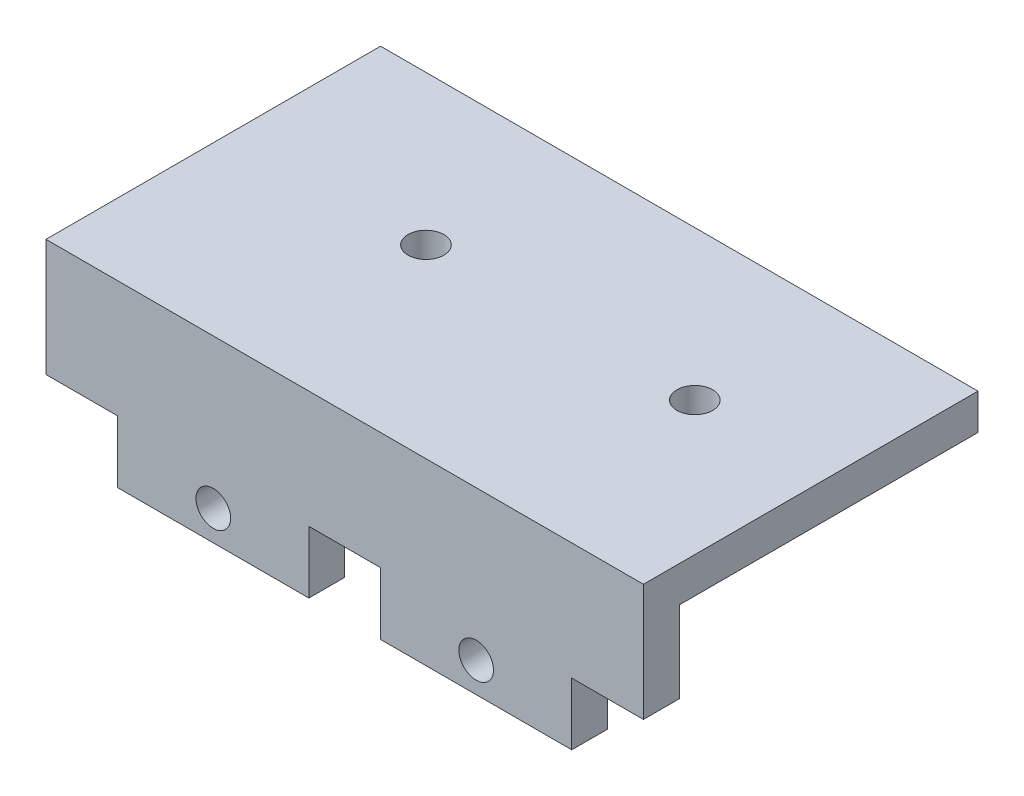
ISO-10303-21;
HEADER;
FILE_DESCRIPTION(('STEP AP214'),'2;1');
FILE_NAME('part.step','',(''),(''),'','','');
FILE_SCHEMA(('AUTOMOTIVE_DESIGN { 1 0 10303 214 1 1 1 1 }'));
ENDSEC;
DATA;
#1=APPLICATION_CONTEXT('core data for automotive mechanical design processes');
#2=APPLICATION_PROTOCOL_DEFINITION('international standard','automotive_design',2000,#1);
#3=PRODUCT_CONTEXT('',#1,'mechanical');
#4=PRODUCT('Part','Part','',(#3));
#5=PRODUCT_RELATED_PRODUCT_CATEGORY('part','',(#4));
#6=PRODUCT_DEFINITION_FORMATION('','',#4);
#7=PRODUCT_DEFINITION_CONTEXT('part definition',#1,'design');
#8=PRODUCT_DEFINITION('design','',#6,#7);
#9=PRODUCT_DEFINITION_SHAPE('','',#8);
#10=(LENGTH_UNIT() NAMED_UNIT(*) SI_UNIT(.MILLI.,.METRE.));
#11=(NAMED_UNIT(*) PLANE_ANGLE_UNIT() SI_UNIT($,.RADIAN.));
#12=(NAMED_UNIT(*) SI_UNIT($,.STERADIAN.) SOLID_ANGLE_UNIT());
#13=UNCERTAINTY_MEASURE_WITH_UNIT(LENGTH_MEASURE(1.E-05),#10,'distance_accuracy_value','');
#14=(GEOMETRIC_REPRESENTATION_CONTEXT(3) GLOBAL_UNCERTAINTY_ASSIGNED_CONTEXT((#13)) GLOBAL_UNIT_ASSIGNED_CONTEXT((#10,
#11,#12)) REPRESENTATION_CONTEXT('',''));
#15=CARTESIAN_POINT('',(0.,0.,0.));
#16=DIRECTION('',(0.,0.,1.));
#17=DIRECTION('',(1.,0.,0.));
#18=AXIS2_PLACEMENT_3D('',#15,#16,#17);
#19=CARTESIAN_POINT('',(0.,-2.5,0.));
#20=DIRECTION('',(0.,1.,0.));
#21=DIRECTION('',(0.,0.,1.));
#22=AXIS2_PLACEMENT_3D('',#19,#20,#21);
#23=PLANE('',#22);
#24=DIRECTION('',(1.,0.,0.));
#25=VECTOR('',#24,1.);
#26=CARTESIAN_POINT('',(-25.,-2.5,15.5));
#27=LINE('',#26,#25);
#28=CARTESIAN_POINT('',(-19.,-2.5,15.5));
#29=VERTEX_POINT('',#28);
#30=CARTESIAN_POINT('',(-3.,-2.5,15.5));
#31=VERTEX_POINT('',#30);
#32=EDGE_CURVE('E256',#29,#31,#27,.T.);
#33=ORIENTED_EDGE('',*,*,#32,.F.);
#34=DIRECTION('',(0.,0.,1.));
#35=VECTOR('',#34,1.);
#36=CARTESIAN_POINT('',(-19.,-2.5,-12.5));
#37=LINE('',#36,#35);
#38=CARTESIAN_POINT('',(-19.,-2.5,12.5));
#39=VERTEX_POINT('',#38);
#40=EDGE_CURVE('E292',#39,#29,#37,.T.);
#41=ORIENTED_EDGE('',*,*,#40,.F.);
#42=DIRECTION('',(-1.,0.,0.));
#43=VECTOR('',#42,1.);
#44=CARTESIAN_POINT('',(49.95,-2.5,12.5));
#45=LINE('',#44,#43);
#46=CARTESIAN_POINT('',(-3.,-2.5,12.5));
#47=VERTEX_POINT('',#46);
#48=EDGE_CURVE('E212',#47,#39,#45,.T.);
#49=ORIENTED_EDGE('',*,*,#48,.F.);
#50=DIRECTION('',(0.,0.,1.));
#51=VECTOR('',#50,1.);
#52=CARTESIAN_POINT('',(-3.,-2.5,-12.5));
#53=LINE('',#52,#51);
#54=EDGE_CURVE('E301',#47,#31,#53,.T.);
#55=ORIENTED_EDGE('',*,*,#54,.T.);
#56=EDGE_LOOP('',(#33,#41,#49,#55));
#57=FACE_BOUND('',#56,.T.);
#58=ADVANCED_FACE('F51',(#57),#23,.F.);
#59=CARTESIAN_POINT('',(0.,0.,15.5));
#60=DIRECTION('',(0.,0.,-1.));
#61=DIRECTION('',(-1.,0.,0.));
#62=AXIS2_PLACEMENT_3D('',#59,#60,#61);
#63=PLANE('',#62);
#64=CARTESIAN_POINT('',(-11.,0.,15.5));
#65=DIRECTION('',(0.,0.,-1.));
#66=DIRECTION('',(-1.,0.,0.));
#67=AXIS2_PLACEMENT_3D('',#64,#65,#66);
#68=CIRCLE('',#67,1.45);
#69=CARTESIAN_POINT('',(-12.45,0.,15.5));
#70=VERTEX_POINT('',#69);
#71=EDGE_CURVE('E186',#70,#70,#68,.T.);
#72=ORIENTED_EDGE('',*,*,#71,.T.);
#73=EDGE_LOOP('',(#72));
#74=FACE_BOUND('',#73,.T.);
#75=CARTESIAN_POINT('',(11.,0.,15.5));
#76=DIRECTION('',(0.,0.,-1.));
#77=DIRECTION('',(-1.,0.,0.));
#78=AXIS2_PLACEMENT_3D('',#75,#76,#77);
#79=CIRCLE('',#78,1.45);
#80=CARTESIAN_POINT('',(9.55,0.,15.5));
#81=VERTEX_POINT('',#80);
#82=EDGE_CURVE('E164',#81,#81,#79,.T.);
#83=ORIENTED_EDGE('',*,*,#82,.T.);
#84=EDGE_LOOP('',(#83));
#85=FACE_BOUND('',#84,.T.);
#86=DIRECTION('',(0.,-1.,0.));
#87=VECTOR('',#86,1.);
#88=CARTESIAN_POINT('',(-25.,-2.5,15.5));
#89=LINE('',#88,#87);
#90=CARTESIAN_POINT('',(-25.,12.5,15.5));
#91=VERTEX_POINT('',#90);
#92=CARTESIAN_POINT('',(-25.,2.7,15.5));
#93=VERTEX_POINT('',#92);
#94=EDGE_CURVE('E250',#91,#93,#89,.T.);
#95=ORIENTED_EDGE('',*,*,#94,.T.);
#96=DIRECTION('',(1.,0.,0.));
#97=VECTOR('',#96,1.);
#98=CARTESIAN_POINT('',(0.,2.7,15.5));
#99=LINE('',#98,#97);
#100=CARTESIAN_POINT('',(-19.,2.7,15.5));
#101=VERTEX_POINT('',#100);
#102=EDGE_CURVE('E208',#93,#101,#99,.T.);
#103=ORIENTED_EDGE('',*,*,#102,.T.);
#104=DIRECTION('',(0.,-1.,0.));
#105=VECTOR('',#104,1.);
#106=CARTESIAN_POINT('',(-19.,0.,15.5));
#107=LINE('',#106,#105);
#108=EDGE_CURVE('E204',#101,#29,#107,.T.);
#109=ORIENTED_EDGE('',*,*,#108,.T.);
#110=ORIENTED_EDGE('',*,*,#32,.T.);
#111=DIRECTION('',(0.,1.,0.));
#112=VECTOR('',#111,1.);
#113=CARTESIAN_POINT('',(-3.,0.,15.5));
#114=LINE('',#113,#112);
#115=CARTESIAN_POINT('',(-3.,2.7,15.5));
#116=VERTEX_POINT('',#115);
#117=EDGE_CURVE('E200',#31,#116,#114,.T.);
#118=ORIENTED_EDGE('',*,*,#117,.T.);
#119=DIRECTION('',(1.,0.,0.));
#120=VECTOR('',#119,1.);
#121=CARTESIAN_POINT('',(0.,2.7,15.5));
#122=LINE('',#121,#120);
#123=CARTESIAN_POINT('',(3.,2.7,15.5));
#124=VERTEX_POINT('',#123);
#125=EDGE_CURVE('E196',#116,#124,#122,.T.);
#126=ORIENTED_EDGE('',*,*,#125,.T.);
#127=DIRECTION('',(0.,-1.,0.));
#128=VECTOR('',#127,1.);
#129=CARTESIAN_POINT('',(3.,0.,15.5));
#130=LINE('',#129,#128);
#131=CARTESIAN_POINT('',(3.,-2.5,15.5));
#132=VERTEX_POINT('',#131);
#133=EDGE_CURVE('E193',#124,#132,#130,.T.);
#134=ORIENTED_EDGE('',*,*,#133,.T.);
#135=CARTESIAN_POINT('',(19.,-2.5,15.5));
#136=VERTEX_POINT('',#135);
#137=EDGE_CURVE('E180',#132,#136,#27,.T.);
#138=ORIENTED_EDGE('',*,*,#137,.T.);
#139=DIRECTION('',(0.,1.,0.));
#140=VECTOR('',#139,1.);
#141=CARTESIAN_POINT('',(19.,0.,15.5));
#142=LINE('',#141,#140);
#143=CARTESIAN_POINT('',(19.,2.7,15.5));
#144=VERTEX_POINT('',#143);
#145=EDGE_CURVE('E163',#136,#144,#142,.T.);
#146=ORIENTED_EDGE('',*,*,#145,.T.);
#147=DIRECTION('',(1.,0.,0.));
#148=VECTOR('',#147,1.);
#149=CARTESIAN_POINT('',(0.,2.7,15.5));
#150=LINE('',#149,#148);
#151=CARTESIAN_POINT('',(25.,2.7,15.5));
#152=VERTEX_POINT('',#151);
#153=EDGE_CURVE('E152',#144,#152,#150,.T.);
#154=ORIENTED_EDGE('',*,*,#153,.T.);
#155=DIRECTION('',(0.,1.,0.));
#156=VECTOR('',#155,1.);
#157=CARTESIAN_POINT('',(25.,-2.5,15.5));
#158=LINE('',#157,#156);
#159=CARTESIAN_POINT('',(25.,12.5,15.5));
#160=VERTEX_POINT('',#159);
#161=EDGE_CURVE('E257',#152,#160,#158,.T.);
#162=ORIENTED_EDGE('',*,*,#161,.T.);
#163=DIRECTION('',(1.,0.,0.));
#164=VECTOR('',#163,1.);
#165=CARTESIAN_POINT('',(-25.,12.5,15.5));
#166=LINE('',#165,#164);
#167=EDGE_CURVE('E221',#91,#160,#166,.T.);
#168=ORIENTED_EDGE('',*,*,#167,.F.);
#169=EDGE_LOOP('',(#95,#103,#109,#110,#118,#126,#134,#138,#146,#154,#162,#168));
#170=FACE_BOUND('',#169,.T.);
#171=ADVANCED_FACE('F177',(#74,#85,#170),#63,.F.);
#172=CARTESIAN_POINT('',(25.,2.5,0.));
#173=DIRECTION('',(-1.,0.,0.));
#174=DIRECTION('',(0.,0.,1.));
#175=AXIS2_PLACEMENT_3D('',#172,#173,#174);
#176=PLANE('',#175);
#177=ORIENTED_EDGE('',*,*,#161,.F.);
#178=DIRECTION('',(0.,0.,1.));
#179=VECTOR('',#178,1.);
#180=CARTESIAN_POINT('',(25.,2.7,-12.5));
#181=LINE('',#180,#179);
#182=CARTESIAN_POINT('',(25.,2.7,12.5));
#183=VERTEX_POINT('',#182);
#184=EDGE_CURVE('E158',#183,#152,#181,.T.);
#185=ORIENTED_EDGE('',*,*,#184,.F.);
#186=DIRECTION('',(0.,1.,0.));
#187=VECTOR('',#186,1.);
#188=CARTESIAN_POINT('',(25.,-2.5,12.5));
#189=LINE('',#188,#187);
#190=CARTESIAN_POINT('',(25.,9.5,12.5));
#191=VERTEX_POINT('',#190);
#192=EDGE_CURVE('E264',#183,#191,#189,.T.);
#193=ORIENTED_EDGE('',*,*,#192,.T.);
#194=DIRECTION('',(0.,0.,-1.));
#195=VECTOR('',#194,1.);
#196=CARTESIAN_POINT('',(25.,9.5,15.5));
#197=LINE('',#196,#195);
#198=CARTESIAN_POINT('',(25.,9.5,-12.5));
#199=VERTEX_POINT('',#198);
#200=EDGE_CURVE('E237',#191,#199,#197,.T.);
#201=ORIENTED_EDGE('',*,*,#200,.T.);
#202=DIRECTION('',(0.,-1.,0.));
#203=VECTOR('',#202,1.);
#204=CARTESIAN_POINT('',(25.,12.5,-12.5));
#205=LINE('',#204,#203);
#206=CARTESIAN_POINT('',(25.,12.5,-12.5));
#207=VERTEX_POINT('',#206);
#208=EDGE_CURVE('E245',#207,#199,#205,.T.);
#209=ORIENTED_EDGE('',*,*,#208,.F.);
#210=DIRECTION('',(0.,0.,-1.));
#211=VECTOR('',#210,1.);
#212=CARTESIAN_POINT('',(25.,12.5,15.5));
#213=LINE('',#212,#211);
#214=EDGE_CURVE('E226',#160,#207,#213,.T.);
#215=ORIENTED_EDGE('',*,*,#214,.F.);
#216=EDGE_LOOP('',(#177,#185,#193,#201,#209,#215));
#217=FACE_BOUND('',#216,.T.);
#218=ADVANCED_FACE('F53',(#217),#176,.F.);
#219=ORIENTED_EDGE('',*,*,#137,.F.);
#220=DIRECTION('',(0.,0.,1.));
#221=VECTOR('',#220,1.);
#222=CARTESIAN_POINT('',(3.,-2.5,-12.5));
#223=LINE('',#222,#221);
#224=CARTESIAN_POINT('',(3.,-2.5,12.5));
#225=VERTEX_POINT('',#224);
#226=EDGE_CURVE('E319',#225,#132,#223,.T.);
#227=ORIENTED_EDGE('',*,*,#226,.F.);
#228=CARTESIAN_POINT('',(19.,-2.5,12.5));
#229=VERTEX_POINT('',#228);
#230=EDGE_CURVE('E216',#229,#225,#45,.T.);
#231=ORIENTED_EDGE('',*,*,#230,.F.);
#232=DIRECTION('',(0.,0.,1.));
#233=VECTOR('',#232,1.);
#234=CARTESIAN_POINT('',(19.,-2.5,-12.5));
#235=LINE('',#234,#233);
#236=EDGE_CURVE('E173',#229,#136,#235,.T.);
#237=ORIENTED_EDGE('',*,*,#236,.T.);
#238=EDGE_LOOP('',(#219,#227,#231,#237));
#239=FACE_BOUND('',#238,.T.);
#240=ADVANCED_FACE('F347',(#239),#23,.F.);
#241=CARTESIAN_POINT('',(-25.,2.5,0.));
#242=DIRECTION('',(-1.,0.,0.));
#243=DIRECTION('',(0.,0.,1.));
#244=AXIS2_PLACEMENT_3D('',#241,#242,#243);
#245=PLANE('',#244);
#246=DIRECTION('',(0.,0.,1.));
#247=VECTOR('',#246,1.);
#248=CARTESIAN_POINT('',(-25.,2.7,-12.5));
#249=LINE('',#248,#247);
#250=CARTESIAN_POINT('',(-25.,2.7,12.5));
#251=VERTEX_POINT('',#250);
#252=EDGE_CURVE('E274',#251,#93,#249,.T.);
#253=ORIENTED_EDGE('',*,*,#252,.T.);
#254=ORIENTED_EDGE('',*,*,#94,.F.);
#255=DIRECTION('',(0.,0.,1.));
#256=VECTOR('',#255,1.);
#257=CARTESIAN_POINT('',(-25.,12.5,15.5));
#258=LINE('',#257,#256);
#259=CARTESIAN_POINT('',(-25.,12.5,-12.5));
#260=VERTEX_POINT('',#259);
#261=EDGE_CURVE('E217',#260,#91,#258,.T.);
#262=ORIENTED_EDGE('',*,*,#261,.F.);
#263=DIRECTION('',(0.,-1.,0.));
#264=VECTOR('',#263,1.);
#265=CARTESIAN_POINT('',(-25.,12.5,-12.5));
#266=LINE('',#265,#264);
#267=CARTESIAN_POINT('',(-25.,9.5,-12.5));
#268=VERTEX_POINT('',#267);
#269=EDGE_CURVE('E232',#260,#268,#266,.T.);
#270=ORIENTED_EDGE('',*,*,#269,.T.);
#271=DIRECTION('',(0.,0.,1.));
#272=VECTOR('',#271,1.);
#273=CARTESIAN_POINT('',(-25.,9.5,15.5));
#274=LINE('',#273,#272);
#275=CARTESIAN_POINT('',(-25.,9.5,12.5));
#276=VERTEX_POINT('',#275);
#277=EDGE_CURVE('E233',#268,#276,#274,.T.);
#278=ORIENTED_EDGE('',*,*,#277,.T.);
#279=DIRECTION('',(0.,-1.,0.));
#280=VECTOR('',#279,1.);
#281=CARTESIAN_POINT('',(-25.,-2.5,12.5));
#282=LINE('',#281,#280);
#283=EDGE_CURVE('E249',#276,#251,#282,.T.);
#284=ORIENTED_EDGE('',*,*,#283,.T.);
#285=EDGE_LOOP('',(#253,#254,#262,#270,#278,#284));
#286=FACE_BOUND('',#285,.T.);
#287=ADVANCED_FACE('F355',(#286),#245,.T.);
#288=CARTESIAN_POINT('',(0.,0.,12.5));
#289=DIRECTION('',(0.,0.,-1.));
#290=DIRECTION('',(-1.,0.,0.));
#291=AXIS2_PLACEMENT_3D('',#288,#289,#290);
#292=PLANE('',#291);
#293=DIRECTION('',(1.,0.,0.));
#294=VECTOR('',#293,1.);
#295=CARTESIAN_POINT('',(0.,2.7,12.5));
#296=LINE('',#295,#294);
#297=CARTESIAN_POINT('',(-19.,2.7,12.5));
#298=VERTEX_POINT('',#297);
#299=EDGE_CURVE('E11',#251,#298,#296,.T.);
#300=ORIENTED_EDGE('',*,*,#299,.F.);
#301=ORIENTED_EDGE('',*,*,#283,.F.);
#302=DIRECTION('',(-1.,0.,0.));
#303=VECTOR('',#302,1.);
#304=CARTESIAN_POINT('',(-25.,9.5,12.5));
#305=LINE('',#304,#303);
#306=EDGE_CURVE('E253',#191,#276,#305,.T.);
#307=ORIENTED_EDGE('',*,*,#306,.F.);
#308=ORIENTED_EDGE('',*,*,#192,.F.);
#309=DIRECTION('',(1.,0.,0.));
#310=VECTOR('',#309,1.);
#311=CARTESIAN_POINT('',(0.,2.7,12.5));
#312=LINE('',#311,#310);
#313=CARTESIAN_POINT('',(19.,2.7,12.5));
#314=VERTEX_POINT('',#313);
#315=EDGE_CURVE('E260',#314,#183,#312,.T.);
#316=ORIENTED_EDGE('',*,*,#315,.F.);
#317=DIRECTION('',(0.,1.,0.));
#318=VECTOR('',#317,1.);
#319=CARTESIAN_POINT('',(19.,0.,12.5));
#320=LINE('',#319,#318);
#321=EDGE_CURVE('E170',#229,#314,#320,.T.);
#322=ORIENTED_EDGE('',*,*,#321,.F.);
#323=ORIENTED_EDGE('',*,*,#230,.T.);
#324=DIRECTION('',(0.,-1.,0.));
#325=VECTOR('',#324,1.);
#326=CARTESIAN_POINT('',(3.,0.,12.5));
#327=LINE('',#326,#325);
#328=CARTESIAN_POINT('',(3.,2.7,12.5));
#329=VERTEX_POINT('',#328);
#330=EDGE_CURVE('E278',#329,#225,#327,.T.);
#331=ORIENTED_EDGE('',*,*,#330,.F.);
#332=DIRECTION('',(1.,0.,0.));
#333=VECTOR('',#332,1.);
#334=CARTESIAN_POINT('',(0.,2.7,12.5));
#335=LINE('',#334,#333);
#336=CARTESIAN_POINT('',(-3.,2.7,12.5));
#337=VERTEX_POINT('',#336);
#338=EDGE_CURVE('E282',#337,#329,#335,.T.);
#339=ORIENTED_EDGE('',*,*,#338,.F.);
#340=DIRECTION('',(0.,1.,0.));
#341=VECTOR('',#340,1.);
#342=CARTESIAN_POINT('',(-3.,0.,12.5));
#343=LINE('',#342,#341);
#344=EDGE_CURVE('E285',#47,#337,#343,.T.);
#345=ORIENTED_EDGE('',*,*,#344,.F.);
#346=ORIENTED_EDGE('',*,*,#48,.T.);
#347=DIRECTION('',(0.,-1.,0.));
#348=VECTOR('',#347,1.);
#349=CARTESIAN_POINT('',(-19.,0.,12.5));
#350=LINE('',#349,#348);
#351=EDGE_CURVE('E61',#298,#39,#350,.T.);
#352=ORIENTED_EDGE('',*,*,#351,.F.);
#353=EDGE_LOOP('',(#300,#301,#307,#308,#316,#322,#323,#331,#339,#345,#346,#352));
#354=FACE_BOUND('',#353,.T.);
#355=CARTESIAN_POINT('',(-11.,0.,12.5));
#356=DIRECTION('',(0.,0.,-1.));
#357=DIRECTION('',(-1.,0.,0.));
#358=AXIS2_PLACEMENT_3D('',#355,#356,#357);
#359=CIRCLE('',#358,1.45);
#360=CARTESIAN_POINT('',(-12.45,0.,12.5));
#361=VERTEX_POINT('',#360);
#362=EDGE_CURVE('E182',#361,#361,#359,.T.);
#363=ORIENTED_EDGE('',*,*,#362,.F.);
#364=EDGE_LOOP('',(#363));
#365=FACE_BOUND('',#364,.T.);
#366=CARTESIAN_POINT('',(11.,0.,12.5));
#367=DIRECTION('',(0.,0.,-1.));
#368=DIRECTION('',(-1.,0.,0.));
#369=AXIS2_PLACEMENT_3D('',#366,#367,#368);
#370=CIRCLE('',#369,1.45);
#371=CARTESIAN_POINT('',(9.55,0.,12.5));
#372=VERTEX_POINT('',#371);
#373=EDGE_CURVE('E270',#372,#372,#370,.T.);
#374=ORIENTED_EDGE('',*,*,#373,.F.);
#375=EDGE_LOOP('',(#374));
#376=FACE_BOUND('',#375,.T.);
#377=ADVANCED_FACE('F304',(#354,#365,#376),#292,.T.);
#378=CARTESIAN_POINT('',(-25.,12.5,-12.5));
#379=DIRECTION('',(0.,0.,1.));
#380=DIRECTION('',(1.,0.,0.));
#381=AXIS2_PLACEMENT_3D('',#378,#379,#380);
#382=PLANE('',#381);
#383=DIRECTION('',(-1.,0.,0.));
#384=VECTOR('',#383,1.);
#385=CARTESIAN_POINT('',(-25.,9.5,-12.5));
#386=LINE('',#385,#384);
#387=EDGE_CURVE('E222',#199,#268,#386,.T.);
#388=ORIENTED_EDGE('',*,*,#387,.T.);
#389=ORIENTED_EDGE('',*,*,#269,.F.);
#390=DIRECTION('',(-1.,0.,0.));
#391=VECTOR('',#390,1.);
#392=CARTESIAN_POINT('',(-25.,12.5,-12.5));
#393=LINE('',#392,#391);
#394=EDGE_CURVE('E229',#207,#260,#393,.T.);
#395=ORIENTED_EDGE('',*,*,#394,.F.);
#396=ORIENTED_EDGE('',*,*,#208,.T.);
#397=EDGE_LOOP('',(#388,#389,#395,#396));
#398=FACE_BOUND('',#397,.T.);
#399=ADVANCED_FACE('F480',(#398),#382,.F.);
#400=CARTESIAN_POINT('',(0.,12.5,0.));
#401=DIRECTION('',(0.,-1.,0.));
#402=DIRECTION('',(0.,0.,-1.));
#403=AXIS2_PLACEMENT_3D('',#400,#401,#402);
#404=PLANE('',#403);
#405=CARTESIAN_POINT('',(13.8,12.5,0.));
#406=DIRECTION('',(0.,-1.,0.));
#407=DIRECTION('',(0.,0.,-1.));
#408=AXIS2_PLACEMENT_3D('',#405,#406,#407);
#409=CIRCLE('',#408,1.5);
#410=CARTESIAN_POINT('',(13.8,12.5,1.5));
#411=VERTEX_POINT('',#410);
#412=EDGE_CURVE('E684',#411,#411,#409,.T.);
#413=ORIENTED_EDGE('',*,*,#412,.T.);
#414=EDGE_LOOP('',(#413));
#415=FACE_BOUND('',#414,.T.);
#416=CARTESIAN_POINT('',(-8.70000000000001,12.5,0.));
#417=DIRECTION('',(0.,-1.,0.));
#418=DIRECTION('',(0.,0.,-1.));
#419=AXIS2_PLACEMENT_3D('',#416,#417,#418);
#420=CIRCLE('',#419,1.5);
#421=CARTESIAN_POINT('',(-8.70000000000001,12.5,1.5));
#422=VERTEX_POINT('',#421);
#423=EDGE_CURVE('E325',#422,#422,#420,.T.);
#424=ORIENTED_EDGE('',*,*,#423,.T.);
#425=EDGE_LOOP('',(#424));
#426=FACE_BOUND('',#425,.T.);
#427=ORIENTED_EDGE('',*,*,#261,.T.);
#428=ORIENTED_EDGE('',*,*,#167,.T.);
#429=ORIENTED_EDGE('',*,*,#214,.T.);
#430=ORIENTED_EDGE('',*,*,#394,.T.);
#431=EDGE_LOOP('',(#427,#428,#429,#430));
#432=FACE_BOUND('',#431,.T.);
#433=ADVANCED_FACE('F341',(#415,#426,#432),#404,.F.);
#434=CARTESIAN_POINT('',(0.,9.5,0.));
#435=DIRECTION('',(0.,-1.,0.));
#436=DIRECTION('',(0.,0.,-1.));
#437=AXIS2_PLACEMENT_3D('',#434,#435,#436);
#438=PLANE('',#437);
#439=CARTESIAN_POINT('',(13.8,9.5,0.));
#440=DIRECTION('',(0.,-1.,0.));
#441=DIRECTION('',(0.,0.,-1.));
#442=AXIS2_PLACEMENT_3D('',#439,#440,#441);
#443=CIRCLE('',#442,1.5);
#444=CARTESIAN_POINT('',(13.8,9.5,1.5));
#445=VERTEX_POINT('',#444);
#446=EDGE_CURVE('E55',#445,#445,#443,.T.);
#447=ORIENTED_EDGE('',*,*,#446,.F.);
#448=EDGE_LOOP('',(#447));
#449=FACE_BOUND('',#448,.T.);
#450=CARTESIAN_POINT('',(-8.70000000000001,9.5,0.));
#451=DIRECTION('',(0.,-1.,0.));
#452=DIRECTION('',(0.,0.,-1.));
#453=AXIS2_PLACEMENT_3D('',#450,#451,#452);
#454=CIRCLE('',#453,1.5);
#455=CARTESIAN_POINT('',(-8.70000000000001,9.5,1.5));
#456=VERTEX_POINT('',#455);
#457=EDGE_CURVE('E689',#456,#456,#454,.T.);
#458=ORIENTED_EDGE('',*,*,#457,.F.);
#459=EDGE_LOOP('',(#458));
#460=FACE_BOUND('',#459,.T.);
#461=ORIENTED_EDGE('',*,*,#200,.F.);
#462=ORIENTED_EDGE('',*,*,#306,.T.);
#463=ORIENTED_EDGE('',*,*,#277,.F.);
#464=ORIENTED_EDGE('',*,*,#387,.F.);
#465=EDGE_LOOP('',(#461,#462,#463,#464));
#466=FACE_BOUND('',#465,.T.);
#467=ADVANCED_FACE('F333',(#449,#460,#466),#438,.T.);
#468=CARTESIAN_POINT('',(11.,0.,-12.5));
#469=DIRECTION('',(0.,0.,1.));
#470=DIRECTION('',(1.,0.,0.));
#471=AXIS2_PLACEMENT_3D('',#468,#469,#470);
#472=CYLINDRICAL_SURFACE('',#471,1.45);
#473=ORIENTED_EDGE('',*,*,#373,.T.);
#474=EDGE_LOOP('',(#473));
#475=FACE_BOUND('',#474,.T.);
#476=ORIENTED_EDGE('',*,*,#82,.F.);
#477=EDGE_LOOP('',(#476));
#478=FACE_BOUND('',#477,.T.);
#479=ADVANCED_FACE('F331',(#475,#478),#472,.F.);
#480=CARTESIAN_POINT('',(19.,-2.5,-12.5));
#481=DIRECTION('',(-1.,0.,0.));
#482=DIRECTION('',(0.,0.,1.));
#483=AXIS2_PLACEMENT_3D('',#480,#481,#482);
#484=PLANE('',#483);
#485=ORIENTED_EDGE('',*,*,#236,.F.);
#486=ORIENTED_EDGE('',*,*,#321,.T.);
#487=DIRECTION('',(0.,0.,1.));
#488=VECTOR('',#487,1.);
#489=CARTESIAN_POINT('',(19.,2.7,-12.5));
#490=LINE('',#489,#488);
#491=EDGE_CURVE('E155',#314,#144,#490,.T.);
#492=ORIENTED_EDGE('',*,*,#491,.T.);
#493=ORIENTED_EDGE('',*,*,#145,.F.);
#494=EDGE_LOOP('',(#485,#486,#492,#493));
#495=FACE_BOUND('',#494,.T.);
#496=ADVANCED_FACE('F167',(#495),#484,.F.);
#497=CARTESIAN_POINT('',(25.,2.7,-12.5));
#498=DIRECTION('',(0.,1.,0.));
#499=DIRECTION('',(-1.,0.,0.));
#500=AXIS2_PLACEMENT_3D('',#497,#498,#499);
#501=PLANE('',#500);
#502=ORIENTED_EDGE('',*,*,#491,.F.);
#503=ORIENTED_EDGE('',*,*,#315,.T.);
#504=ORIENTED_EDGE('',*,*,#184,.T.);
#505=ORIENTED_EDGE('',*,*,#153,.F.);
#506=EDGE_LOOP('',(#502,#503,#504,#505));
#507=FACE_BOUND('',#506,.T.);
#508=ADVANCED_FACE('F154',(#507),#501,.F.);
#509=CARTESIAN_POINT('',(-11.,0.,-12.5));
#510=DIRECTION('',(0.,0.,1.));
#511=DIRECTION('',(1.,0.,0.));
#512=AXIS2_PLACEMENT_3D('',#509,#510,#511);
#513=CYLINDRICAL_SURFACE('',#512,1.45);
#514=ORIENTED_EDGE('',*,*,#362,.T.);
#515=EDGE_LOOP('',(#514));
#516=FACE_BOUND('',#515,.T.);
#517=ORIENTED_EDGE('',*,*,#71,.F.);
#518=EDGE_LOOP('',(#517));
#519=FACE_BOUND('',#518,.T.);
#520=ADVANCED_FACE('F401',(#516,#519),#513,.F.);
#521=CARTESIAN_POINT('',(-3.,-2.5,-12.5));
#522=DIRECTION('',(-1.,0.,0.));
#523=DIRECTION('',(0.,-1.,0.));
#524=AXIS2_PLACEMENT_3D('',#521,#522,#523);
#525=PLANE('',#524);
#526=ORIENTED_EDGE('',*,*,#54,.F.);
#527=ORIENTED_EDGE('',*,*,#344,.T.);
#528=DIRECTION('',(0.,0.,1.));
#529=VECTOR('',#528,1.);
#530=CARTESIAN_POINT('',(-3.,2.7,-12.5));
#531=LINE('',#530,#529);
#532=EDGE_CURVE('E312',#337,#116,#531,.T.);
#533=ORIENTED_EDGE('',*,*,#532,.T.);
#534=ORIENTED_EDGE('',*,*,#117,.F.);
#535=EDGE_LOOP('',(#526,#527,#533,#534));
#536=FACE_BOUND('',#535,.T.);
#537=ADVANCED_FACE('F311',(#536),#525,.F.);
#538=CARTESIAN_POINT('',(-3.,2.7,-12.5));
#539=DIRECTION('',(0.,1.,0.));
#540=DIRECTION('',(0.,0.,1.));
#541=AXIS2_PLACEMENT_3D('',#538,#539,#540);
#542=PLANE('',#541);
#543=ORIENTED_EDGE('',*,*,#532,.F.);
#544=ORIENTED_EDGE('',*,*,#338,.T.);
#545=DIRECTION('',(0.,0.,1.));
#546=VECTOR('',#545,1.);
#547=CARTESIAN_POINT('',(3.,2.7,-12.5));
#548=LINE('',#547,#546);
#549=EDGE_CURVE('E75',#329,#124,#548,.T.);
#550=ORIENTED_EDGE('',*,*,#549,.T.);
#551=ORIENTED_EDGE('',*,*,#125,.F.);
#552=EDGE_LOOP('',(#543,#544,#550,#551));
#553=FACE_BOUND('',#552,.T.);
#554=ADVANCED_FACE('F314',(#553),#542,.F.);
#555=CARTESIAN_POINT('',(3.,-2.5,-12.5));
#556=DIRECTION('',(1.,0.,0.));
#557=DIRECTION('',(0.,0.,-1.));
#558=AXIS2_PLACEMENT_3D('',#555,#556,#557);
#559=PLANE('',#558);
#560=ORIENTED_EDGE('',*,*,#549,.F.);
#561=ORIENTED_EDGE('',*,*,#330,.T.);
#562=ORIENTED_EDGE('',*,*,#226,.T.);
#563=ORIENTED_EDGE('',*,*,#133,.F.);
#564=EDGE_LOOP('',(#560,#561,#562,#563));
#565=FACE_BOUND('',#564,.T.);
#566=ADVANCED_FACE('F387',(#565),#559,.F.);
#567=CARTESIAN_POINT('',(-25.,2.7,-12.5));
#568=DIRECTION('',(0.,1.,0.));
#569=DIRECTION('',(0.,0.,1.));
#570=AXIS2_PLACEMENT_3D('',#567,#568,#569);
#571=PLANE('',#570);
#572=ORIENTED_EDGE('',*,*,#252,.F.);
#573=ORIENTED_EDGE('',*,*,#299,.T.);
#574=DIRECTION('',(0.,0.,1.));
#575=VECTOR('',#574,1.);
#576=CARTESIAN_POINT('',(-19.,2.7,-12.5));
#577=LINE('',#576,#575);
#578=EDGE_CURVE('E68',#298,#101,#577,.T.);
#579=ORIENTED_EDGE('',*,*,#578,.T.);
#580=ORIENTED_EDGE('',*,*,#102,.F.);
#581=EDGE_LOOP('',(#572,#573,#579,#580));
#582=FACE_BOUND('',#581,.T.);
#583=ADVANCED_FACE('F378',(#582),#571,.F.);
#584=CARTESIAN_POINT('',(-19.,-2.5,-12.5));
#585=DIRECTION('',(1.,0.,0.));
#586=DIRECTION('',(0.,0.,-1.));
#587=AXIS2_PLACEMENT_3D('',#584,#585,#586);
#588=PLANE('',#587);
#589=ORIENTED_EDGE('',*,*,#578,.F.);
#590=ORIENTED_EDGE('',*,*,#351,.T.);
#591=ORIENTED_EDGE('',*,*,#40,.T.);
#592=ORIENTED_EDGE('',*,*,#108,.F.);
#593=EDGE_LOOP('',(#589,#590,#591,#592));
#594=FACE_BOUND('',#593,.T.);
#595=ADVANCED_FACE('F291',(#594),#588,.F.);
#596=CARTESIAN_POINT('',(-8.70000000000001,-2.5,0.));
#597=DIRECTION('',(0.,1.,0.));
#598=DIRECTION('',(0.,0.,1.));
#599=AXIS2_PLACEMENT_3D('',#596,#597,#598);
#600=CYLINDRICAL_SURFACE('',#599,1.5);
#601=CARTESIAN_POINT('',(-8.70000000000001,9.5,1.5));
#602=CARTESIAN_POINT('',(-8.70000000000001,9.53125,1.5));
#603=CARTESIAN_POINT('',(-8.70000000000001,9.5625,1.5));
#604=CARTESIAN_POINT('',(-8.70000000000001,9.625,1.5));
#605=CARTESIAN_POINT('',(-8.70000000000001,9.65625,1.5));
#606=CARTESIAN_POINT('',(-8.70000000000001,9.71875,1.5));
#607=CARTESIAN_POINT('',(-8.70000000000001,9.75,1.5));
#608=CARTESIAN_POINT('',(-8.70000000000001,9.8125,1.5));
#609=CARTESIAN_POINT('',(-8.70000000000001,9.84375,1.5));
#610=CARTESIAN_POINT('',(-8.70000000000001,9.90625,1.5));
#611=CARTESIAN_POINT('',(-8.70000000000001,9.9375,1.5));
#612=CARTESIAN_POINT('',(-8.70000000000001,10.,1.5));
#613=CARTESIAN_POINT('',(-8.70000000000001,10.03125,1.5));
#614=CARTESIAN_POINT('',(-8.70000000000001,10.09375,1.5));
#615=CARTESIAN_POINT('',(-8.70000000000001,10.125,1.5));
#616=CARTESIAN_POINT('',(-8.70000000000001,10.1875,1.5));
#617=CARTESIAN_POINT('',(-8.70000000000001,10.21875,1.5));
#618=CARTESIAN_POINT('',(-8.70000000000001,10.28125,1.5));
#619=CARTESIAN_POINT('',(-8.70000000000001,10.3125,1.5));
#620=CARTESIAN_POINT('',(-8.70000000000001,10.375,1.5));
#621=CARTESIAN_POINT('',(-8.70000000000001,10.40625,1.5));
#622=CARTESIAN_POINT('',(-8.70000000000001,10.46875,1.5));
#623=CARTESIAN_POINT('',(-8.70000000000001,10.5,1.5));
#624=CARTESIAN_POINT('',(-8.70000000000001,10.5625,1.5));
#625=CARTESIAN_POINT('',(-8.70000000000001,10.59375,1.5));
#626=CARTESIAN_POINT('',(-8.70000000000001,10.65625,1.5));
#627=CARTESIAN_POINT('',(-8.70000000000001,10.6875,1.5));
#628=CARTESIAN_POINT('',(-8.70000000000001,10.75,1.5));
#629=CARTESIAN_POINT('',(-8.70000000000001,10.78125,1.5));
#630=CARTESIAN_POINT('',(-8.70000000000001,10.84375,1.5));
#631=CARTESIAN_POINT('',(-8.70000000000001,10.875,1.5));
#632=CARTESIAN_POINT('',(-8.70000000000001,10.9375,1.5));
#633=CARTESIAN_POINT('',(-8.70000000000001,10.96875,1.5));
#634=CARTESIAN_POINT('',(-8.70000000000001,11.03125,1.5));
#635=CARTESIAN_POINT('',(-8.70000000000001,11.0625,1.5));
#636=CARTESIAN_POINT('',(-8.70000000000001,11.125,1.5));
#637=CARTESIAN_POINT('',(-8.70000000000001,11.15625,1.5));
#638=CARTESIAN_POINT('',(-8.70000000000001,11.21875,1.5));
#639=CARTESIAN_POINT('',(-8.70000000000001,11.25,1.5));
#640=CARTESIAN_POINT('',(-8.70000000000001,11.3125,1.5));
#641=CARTESIAN_POINT('',(-8.70000000000001,11.34375,1.5));
#642=CARTESIAN_POINT('',(-8.70000000000001,11.40625,1.5));
#643=CARTESIAN_POINT('',(-8.70000000000001,11.4375,1.5));
#644=CARTESIAN_POINT('',(-8.70000000000001,11.5,1.5));
#645=CARTESIAN_POINT('',(-8.70000000000001,11.53125,1.5));
#646=CARTESIAN_POINT('',(-8.70000000000001,11.59375,1.5));
#647=CARTESIAN_POINT('',(-8.70000000000001,11.625,1.5));
#648=CARTESIAN_POINT('',(-8.70000000000001,11.6875,1.5));
#649=CARTESIAN_POINT('',(-8.70000000000001,11.71875,1.5));
#650=CARTESIAN_POINT('',(-8.70000000000001,11.78125,1.5));
#651=CARTESIAN_POINT('',(-8.70000000000001,11.8125,1.5));
#652=CARTESIAN_POINT('',(-8.70000000000001,11.875,1.5));
#653=CARTESIAN_POINT('',(-8.70000000000001,11.90625,1.5));
#654=CARTESIAN_POINT('',(-8.70000000000001,11.96875,1.5));
#655=CARTESIAN_POINT('',(-8.70000000000001,12.,1.5));
#656=CARTESIAN_POINT('',(-8.70000000000001,12.0625,1.5));
#657=CARTESIAN_POINT('',(-8.70000000000001,12.09375,1.5));
#658=CARTESIAN_POINT('',(-8.70000000000001,12.15625,1.5));
#659=CARTESIAN_POINT('',(-8.70000000000001,12.1875,1.5));
#660=CARTESIAN_POINT('',(-8.70000000000001,12.25,1.5));
#661=CARTESIAN_POINT('',(-8.70000000000001,12.28125,1.5));
#662=CARTESIAN_POINT('',(-8.70000000000001,12.34375,1.5));
#663=CARTESIAN_POINT('',(-8.70000000000001,12.375,1.5));
#664=CARTESIAN_POINT('',(-8.70000000000001,12.4375,1.5));
#665=CARTESIAN_POINT('',(-8.70000000000001,12.46875,1.5));
#666=CARTESIAN_POINT('',(-8.70000000000001,12.5,1.5));
#667=B_SPLINE_CURVE_WITH_KNOTS('',3,(#601,#602,#603,#604,#605,#606,#607,#608,#609,#610,#611,
#612,#613,#614,#615,#616,#617,#618,#619,#620,#621,#622,#623,#624,#625,#626,#627,#628,#629,#630,
#631,#632,#633,#634,#635,#636,#637,#638,#639,#640,#641,#642,#643,#644,#645,#646,#647,#648,#649,
#650,#651,#652,#653,#654,#655,#656,#657,#658,#659,#660,#661,#662,#663,#664,#665,#666),
.UNSPECIFIED.,.F.,.F.,(4,2,2,2,2,2,2,2,2,2,2,2,2,2,2,2,2,2,2,2,2,2,2,2,2,2,2,2,2,2,2,2,4),(0.,
0.0937500000000001,0.1875,0.28125,0.375,0.46875,0.5625,0.656250000000001,0.750000000000001,
0.843749999999999,0.937499999999999,1.03125,1.125,1.21875,1.3125,1.40625,1.5,1.59375,1.6875,
1.78125,1.875,1.96875,2.0625,2.15625,2.25,2.34375,2.4375,2.53125,2.625,2.71875,2.8125,2.90625,
3.),.UNSPECIFIED.);
#668=EDGE_CURVE('BSEAM442',#456,#422,#667,.T.);
#669=ORIENTED_EDGE('',*,*,#457,.T.);
#670=ORIENTED_EDGE('',*,*,#423,.F.);
#671=ORIENTED_EDGE('',*,*,#668,.T.);
#672=ORIENTED_EDGE('',*,*,#668,.F.);
#673=EDGE_LOOP('',(#669,#671,#670,#672));
#674=FACE_BOUND('',#673,.T.);
#675=ADVANCED_FACE('F442',(#674),#600,.F.);
#676=CARTESIAN_POINT('',(13.8,-2.5,0.));
#677=DIRECTION('',(0.,1.,0.));
#678=DIRECTION('',(0.,0.,1.));
#679=AXIS2_PLACEMENT_3D('',#676,#677,#678);
#680=CYLINDRICAL_SURFACE('',#679,1.5);
#681=CARTESIAN_POINT('',(13.8,9.5,1.5));
#682=CARTESIAN_POINT('',(13.8,9.53125,1.5));
#683=CARTESIAN_POINT('',(13.8,9.5625,1.5));
#684=CARTESIAN_POINT('',(13.8,9.625,1.5));
#685=CARTESIAN_POINT('',(13.8,9.65625,1.5));
#686=CARTESIAN_POINT('',(13.8,9.71875,1.5));
#687=CARTESIAN_POINT('',(13.8,9.75,1.5));
#688=CARTESIAN_POINT('',(13.8,9.8125,1.5));
#689=CARTESIAN_POINT('',(13.8,9.84375,1.5));
#690=CARTESIAN_POINT('',(13.8,9.90625,1.5));
#691=CARTESIAN_POINT('',(13.8,9.9375,1.5));
#692=CARTESIAN_POINT('',(13.8,10.,1.5));
#693=CARTESIAN_POINT('',(13.8,10.03125,1.5));
#694=CARTESIAN_POINT('',(13.8,10.09375,1.5));
#695=CARTESIAN_POINT('',(13.8,10.125,1.5));
#696=CARTESIAN_POINT('',(13.8,10.1875,1.5));
#697=CARTESIAN_POINT('',(13.8,10.21875,1.5));
#698=CARTESIAN_POINT('',(13.8,10.28125,1.5));
#699=CARTESIAN_POINT('',(13.8,10.3125,1.5));
#700=CARTESIAN_POINT('',(13.8,10.375,1.5));
#701=CARTESIAN_POINT('',(13.8,10.40625,1.5));
#702=CARTESIAN_POINT('',(13.8,10.46875,1.5));
#703=CARTESIAN_POINT('',(13.8,10.5,1.5));
#704=CARTESIAN_POINT('',(13.8,10.5625,1.5));
#705=CARTESIAN_POINT('',(13.8,10.59375,1.5));
#706=CARTESIAN_POINT('',(13.8,10.65625,1.5));
#707=CARTESIAN_POINT('',(13.8,10.6875,1.5));
#708=CARTESIAN_POINT('',(13.8,10.75,1.5));
#709=CARTESIAN_POINT('',(13.8,10.78125,1.5));
#710=CARTESIAN_POINT('',(13.8,10.84375,1.5));
#711=CARTESIAN_POINT('',(13.8,10.875,1.5));
#712=CARTESIAN_POINT('',(13.8,10.9375,1.5));
#713=CARTESIAN_POINT('',(13.8,10.96875,1.5));
#714=CARTESIAN_POINT('',(13.8,11.03125,1.5));
#715=CARTESIAN_POINT('',(13.8,11.0625,1.5));
#716=CARTESIAN_POINT('',(13.8,11.125,1.5));
#717=CARTESIAN_POINT('',(13.8,11.15625,1.5));
#718=CARTESIAN_POINT('',(13.8,11.21875,1.5));
#719=CARTESIAN_POINT('',(13.8,11.25,1.5));
#720=CARTESIAN_POINT('',(13.8,11.3125,1.5));
#721=CARTESIAN_POINT('',(13.8,11.34375,1.5));
#722=CARTESIAN_POINT('',(13.8,11.40625,1.5));
#723=CARTESIAN_POINT('',(13.8,11.4375,1.5));
#724=CARTESIAN_POINT('',(13.8,11.5,1.5));
#725=CARTESIAN_POINT('',(13.8,11.53125,1.5));
#726=CARTESIAN_POINT('',(13.8,11.59375,1.5));
#727=CARTESIAN_POINT('',(13.8,11.625,1.5));
#728=CARTESIAN_POINT('',(13.8,11.6875,1.5));
#729=CARTESIAN_POINT('',(13.8,11.71875,1.5));
#730=CARTESIAN_POINT('',(13.8,11.78125,1.5));
#731=CARTESIAN_POINT('',(13.8,11.8125,1.5));
#732=CARTESIAN_POINT('',(13.8,11.875,1.5));
#733=CARTESIAN_POINT('',(13.8,11.90625,1.5));
#734=CARTESIAN_POINT('',(13.8,11.96875,1.5));
#735=CARTESIAN_POINT('',(13.8,12.,1.5));
#736=CARTESIAN_POINT('',(13.8,12.0625,1.5));
#737=CARTESIAN_POINT('',(13.8,12.09375,1.5));
#738=CARTESIAN_POINT('',(13.8,12.15625,1.5));
#739=CARTESIAN_POINT('',(13.8,12.1875,1.5));
#740=CARTESIAN_POINT('',(13.8,12.25,1.5));
#741=CARTESIAN_POINT('',(13.8,12.28125,1.5));
#742=CARTESIAN_POINT('',(13.8,12.34375,1.5));
#743=CARTESIAN_POINT('',(13.8,12.375,1.5));
#744=CARTESIAN_POINT('',(13.8,12.4375,1.5));
#745=CARTESIAN_POINT('',(13.8,12.46875,1.5));
#746=CARTESIAN_POINT('',(13.8,12.5,1.5));
#747=B_SPLINE_CURVE_WITH_KNOTS('',3,(#681,#682,#683,#684,#685,#686,#687,#688,#689,#690,#691,
#692,#693,#694,#695,#696,#697,#698,#699,#700,#701,#702,#703,#704,#705,#706,#707,#708,#709,#710,
#711,#712,#713,#714,#715,#716,#717,#718,#719,#720,#721,#722,#723,#724,#725,#726,#727,#728,#729,
#730,#731,#732,#733,#734,#735,#736,#737,#738,#739,#740,#741,#742,#743,#744,#745,#746),
.UNSPECIFIED.,.F.,.F.,(4,2,2,2,2,2,2,2,2,2,2,2,2,2,2,2,2,2,2,2,2,2,2,2,2,2,2,2,2,2,2,2,4),(0.,
0.0937500000000001,0.1875,0.28125,0.375,0.46875,0.5625,0.656250000000001,0.750000000000001,
0.843749999999999,0.937499999999999,1.03125,1.125,1.21875,1.3125,1.40625,1.5,1.59375,1.6875,
1.78125,1.875,1.96875,2.0625,2.15625,2.25,2.34375,2.4375,2.53125,2.625,2.71875,2.8125,2.90625,
3.),.UNSPECIFIED.);
#748=EDGE_CURVE('BSEAM450',#445,#411,#747,.T.);
#749=ORIENTED_EDGE('',*,*,#446,.T.);
#750=ORIENTED_EDGE('',*,*,#412,.F.);
#751=ORIENTED_EDGE('',*,*,#748,.T.);
#752=ORIENTED_EDGE('',*,*,#748,.F.);
#753=EDGE_LOOP('',(#749,#751,#750,#752));
#754=FACE_BOUND('',#753,.T.);
#755=ADVANCED_FACE('F450',(#754),#680,.F.);
#756=CLOSED_SHELL('',(#58,#171,#218,#240,#287,#377,#399,#433,#467,#479,#496,#508,#520,#537,#554,
#566,#583,#595,#675,#755));
#757=MANIFOLD_SOLID_BREP('B2',#756);
#758=ADVANCED_BREP_SHAPE_REPRESENTATION('',(#18,#757),#14);
#759=SHAPE_DEFINITION_REPRESENTATION(#9,#758);
ENDSEC;
END-ISO-10303-21;
